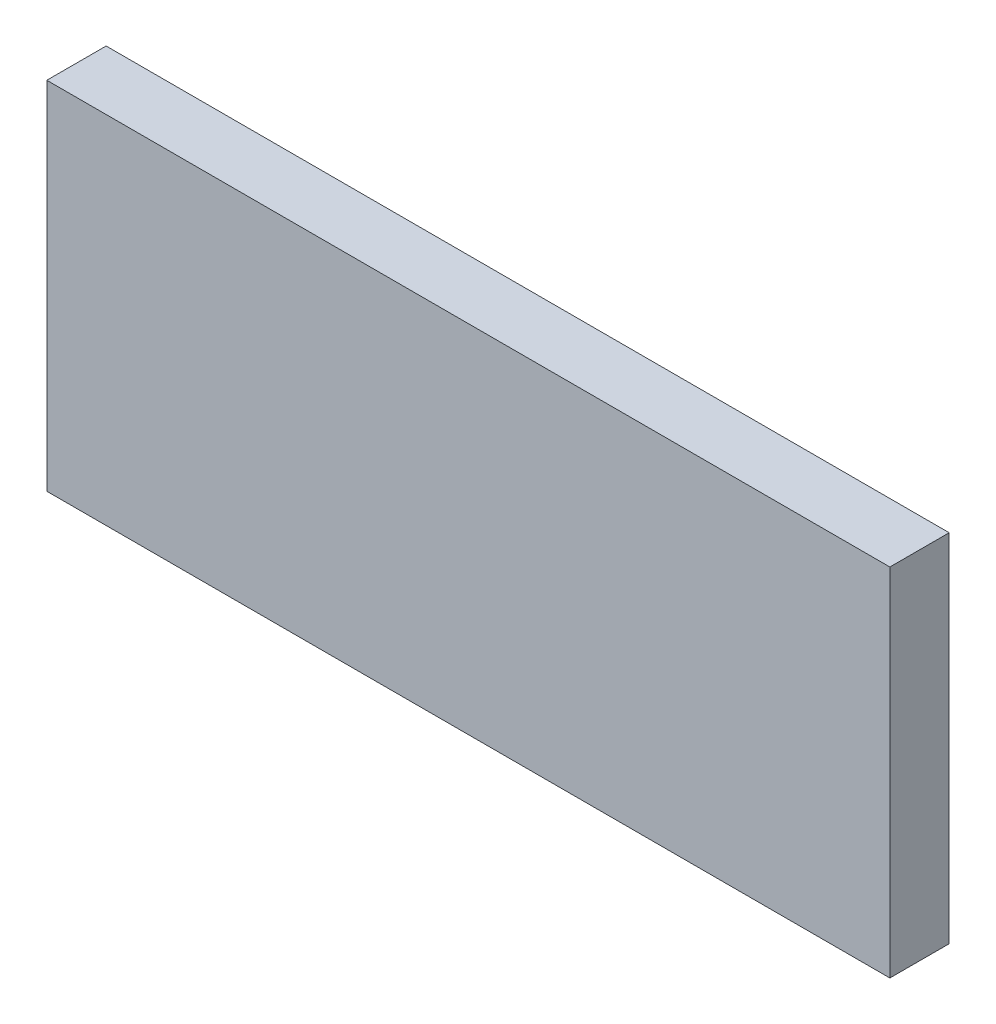
ISO-10303-21;
HEADER;
FILE_DESCRIPTION(('STEP AP214'),'2;1');
FILE_NAME('part.step','',(''),(''),'','','');
FILE_SCHEMA(('AUTOMOTIVE_DESIGN { 1 0 10303 214 1 1 1 1 }'));
ENDSEC;
DATA;
#1=APPLICATION_CONTEXT('core data for automotive mechanical design processes');
#2=APPLICATION_PROTOCOL_DEFINITION('international standard','automotive_design',2000,#1);
#3=PRODUCT_CONTEXT('',#1,'mechanical');
#4=PRODUCT('Part','Part','',(#3));
#5=PRODUCT_RELATED_PRODUCT_CATEGORY('part','',(#4));
#6=PRODUCT_DEFINITION_FORMATION('','',#4);
#7=PRODUCT_DEFINITION_CONTEXT('part definition',#1,'design');
#8=PRODUCT_DEFINITION('design','',#6,#7);
#9=PRODUCT_DEFINITION_SHAPE('','',#8);
#10=(LENGTH_UNIT() NAMED_UNIT(*) SI_UNIT(.MILLI.,.METRE.));
#11=(NAMED_UNIT(*) PLANE_ANGLE_UNIT() SI_UNIT($,.RADIAN.));
#12=(NAMED_UNIT(*) SI_UNIT($,.STERADIAN.) SOLID_ANGLE_UNIT());
#13=UNCERTAINTY_MEASURE_WITH_UNIT(LENGTH_MEASURE(1.E-05),#10,'distance_accuracy_value','');
#14=(GEOMETRIC_REPRESENTATION_CONTEXT(3) GLOBAL_UNCERTAINTY_ASSIGNED_CONTEXT((#13)) GLOBAL_UNIT_ASSIGNED_CONTEXT((#10,
#11,#12)) REPRESENTATION_CONTEXT('',''));
#15=CARTESIAN_POINT('',(0.,0.,0.));
#16=DIRECTION('',(0.,0.,1.));
#17=DIRECTION('',(1.,0.,0.));
#18=AXIS2_PLACEMENT_3D('',#15,#16,#17);
#19=CARTESIAN_POINT('',(-13.5,-5.7,1.9));
#20=DIRECTION('',(1.,0.,0.));
#21=DIRECTION('',(0.,0.,-1.));
#22=AXIS2_PLACEMENT_3D('',#19,#20,#21);
#23=PLANE('',#22);
#24=DIRECTION('',(0.,-1.,0.));
#25=VECTOR('',#24,1.);
#26=CARTESIAN_POINT('',(-13.5,-5.7,0.));
#27=LINE('',#26,#25);
#28=CARTESIAN_POINT('',(-13.5,5.7,0.));
#29=VERTEX_POINT('',#28);
#30=CARTESIAN_POINT('',(-13.5,-5.7,0.));
#31=VERTEX_POINT('',#30);
#32=EDGE_CURVE('E107',#29,#31,#27,.T.);
#33=ORIENTED_EDGE('',*,*,#32,.T.);
#34=DIRECTION('',(0.,0.,-1.));
#35=VECTOR('',#34,1.);
#36=CARTESIAN_POINT('',(-13.5,-5.7,1.9));
#37=LINE('',#36,#35);
#38=CARTESIAN_POINT('',(-13.5,-5.7,1.9));
#39=VERTEX_POINT('',#38);
#40=EDGE_CURVE('E11',#39,#31,#37,.T.);
#41=ORIENTED_EDGE('',*,*,#40,.F.);
#42=DIRECTION('',(0.,-1.,0.));
#43=VECTOR('',#42,1.);
#44=CARTESIAN_POINT('',(-13.5,-5.7,1.9));
#45=LINE('',#44,#43);
#46=CARTESIAN_POINT('',(-13.5,5.7,1.9));
#47=VERTEX_POINT('',#46);
#48=EDGE_CURVE('E91',#47,#39,#45,.T.);
#49=ORIENTED_EDGE('',*,*,#48,.F.);
#50=DIRECTION('',(0.,0.,-1.));
#51=VECTOR('',#50,1.);
#52=CARTESIAN_POINT('',(-13.5,5.7,1.9));
#53=LINE('',#52,#51);
#54=EDGE_CURVE('E103',#47,#29,#53,.T.);
#55=ORIENTED_EDGE('',*,*,#54,.T.);
#56=EDGE_LOOP('',(#33,#41,#49,#55));
#57=FACE_BOUND('',#56,.T.);
#58=ADVANCED_FACE('F39',(#57),#23,.F.);
#59=CARTESIAN_POINT('',(13.5,-5.7,1.9));
#60=DIRECTION('',(0.,1.,0.));
#61=DIRECTION('',(-1.,0.,0.));
#62=AXIS2_PLACEMENT_3D('',#59,#60,#61);
#63=PLANE('',#62);
#64=DIRECTION('',(1.,0.,0.));
#65=VECTOR('',#64,1.);
#66=CARTESIAN_POINT('',(13.5,-5.7,0.));
#67=LINE('',#66,#65);
#68=CARTESIAN_POINT('',(13.5,-5.7,0.));
#69=VERTEX_POINT('',#68);
#70=EDGE_CURVE('E96',#31,#69,#67,.T.);
#71=ORIENTED_EDGE('',*,*,#70,.T.);
#72=DIRECTION('',(0.,0.,-1.));
#73=VECTOR('',#72,1.);
#74=CARTESIAN_POINT('',(13.5,-5.7,1.9));
#75=LINE('',#74,#73);
#76=CARTESIAN_POINT('',(13.5,-5.7,1.9));
#77=VERTEX_POINT('',#76);
#78=EDGE_CURVE('E48',#77,#69,#75,.T.);
#79=ORIENTED_EDGE('',*,*,#78,.F.);
#80=DIRECTION('',(1.,0.,0.));
#81=VECTOR('',#80,1.);
#82=CARTESIAN_POINT('',(13.5,-5.7,1.9));
#83=LINE('',#82,#81);
#84=EDGE_CURVE('E86',#39,#77,#83,.T.);
#85=ORIENTED_EDGE('',*,*,#84,.F.);
#86=ORIENTED_EDGE('',*,*,#40,.T.);
#87=EDGE_LOOP('',(#71,#79,#85,#86));
#88=FACE_BOUND('',#87,.T.);
#89=ADVANCED_FACE('F95',(#88),#63,.F.);
#90=CARTESIAN_POINT('',(13.5,-5.7,1.9));
#91=DIRECTION('',(-1.,0.,0.));
#92=DIRECTION('',(0.,0.,1.));
#93=AXIS2_PLACEMENT_3D('',#90,#91,#92);
#94=PLANE('',#93);
#95=DIRECTION('',(0.,1.,0.));
#96=VECTOR('',#95,1.);
#97=CARTESIAN_POINT('',(13.5,-5.7,0.));
#98=LINE('',#97,#96);
#99=CARTESIAN_POINT('',(13.5,5.7,0.));
#100=VERTEX_POINT('',#99);
#101=EDGE_CURVE('E73',#69,#100,#98,.T.);
#102=ORIENTED_EDGE('',*,*,#101,.T.);
#103=DIRECTION('',(0.,0.,-1.));
#104=VECTOR('',#103,1.);
#105=CARTESIAN_POINT('',(13.5,5.7,1.9));
#106=LINE('',#105,#104);
#107=CARTESIAN_POINT('',(13.5,5.7,1.9));
#108=VERTEX_POINT('',#107);
#109=EDGE_CURVE('E98',#108,#100,#106,.T.);
#110=ORIENTED_EDGE('',*,*,#109,.F.);
#111=DIRECTION('',(0.,1.,0.));
#112=VECTOR('',#111,1.);
#113=CARTESIAN_POINT('',(13.5,-5.7,1.9));
#114=LINE('',#113,#112);
#115=EDGE_CURVE('E89',#77,#108,#114,.T.);
#116=ORIENTED_EDGE('',*,*,#115,.F.);
#117=ORIENTED_EDGE('',*,*,#78,.T.);
#118=EDGE_LOOP('',(#102,#110,#116,#117));
#119=FACE_BOUND('',#118,.T.);
#120=ADVANCED_FACE('F99',(#119),#94,.F.);
#121=CARTESIAN_POINT('',(13.5,5.7,1.9));
#122=DIRECTION('',(0.,-1.,0.));
#123=DIRECTION('',(1.,0.,0.));
#124=AXIS2_PLACEMENT_3D('',#121,#122,#123);
#125=PLANE('',#124);
#126=DIRECTION('',(-1.,0.,0.));
#127=VECTOR('',#126,1.);
#128=CARTESIAN_POINT('',(13.5,5.7,0.));
#129=LINE('',#128,#127);
#130=EDGE_CURVE('E79',#100,#29,#129,.T.);
#131=ORIENTED_EDGE('',*,*,#130,.T.);
#132=ORIENTED_EDGE('',*,*,#54,.F.);
#133=DIRECTION('',(-1.,0.,0.));
#134=VECTOR('',#133,1.);
#135=CARTESIAN_POINT('',(13.5,5.7,1.9));
#136=LINE('',#135,#134);
#137=EDGE_CURVE('E56',#108,#47,#136,.T.);
#138=ORIENTED_EDGE('',*,*,#137,.F.);
#139=ORIENTED_EDGE('',*,*,#109,.T.);
#140=EDGE_LOOP('',(#131,#132,#138,#139));
#141=FACE_BOUND('',#140,.T.);
#142=ADVANCED_FACE('F120',(#141),#125,.F.);
#143=CARTESIAN_POINT('',(0.,0.,1.9));
#144=DIRECTION('',(0.,0.,1.));
#145=DIRECTION('',(1.,0.,0.));
#146=AXIS2_PLACEMENT_3D('',#143,#144,#145);
#147=PLANE('',#146);
#148=ORIENTED_EDGE('',*,*,#48,.T.);
#149=ORIENTED_EDGE('',*,*,#84,.T.);
#150=ORIENTED_EDGE('',*,*,#115,.T.);
#151=ORIENTED_EDGE('',*,*,#137,.T.);
#152=EDGE_LOOP('',(#148,#149,#150,#151));
#153=FACE_BOUND('',#152,.T.);
#154=ADVANCED_FACE('F87',(#153),#147,.T.);
#155=CARTESIAN_POINT('',(0.,0.,0.));
#156=DIRECTION('',(0.,0.,1.));
#157=DIRECTION('',(1.,0.,0.));
#158=AXIS2_PLACEMENT_3D('',#155,#156,#157);
#159=PLANE('',#158);
#160=ORIENTED_EDGE('',*,*,#32,.F.);
#161=ORIENTED_EDGE('',*,*,#130,.F.);
#162=ORIENTED_EDGE('',*,*,#101,.F.);
#163=ORIENTED_EDGE('',*,*,#70,.F.);
#164=EDGE_LOOP('',(#160,#161,#162,#163));
#165=FACE_BOUND('',#164,.T.);
#166=ADVANCED_FACE('F123',(#165),#159,.F.);
#167=CLOSED_SHELL('',(#58,#89,#120,#142,#154,#166));
#168=MANIFOLD_SOLID_BREP('B2',#167);
#169=ADVANCED_BREP_SHAPE_REPRESENTATION('',(#18,#168),#14);
#170=SHAPE_DEFINITION_REPRESENTATION(#9,#169);
ENDSEC;
END-ISO-10303-21;
